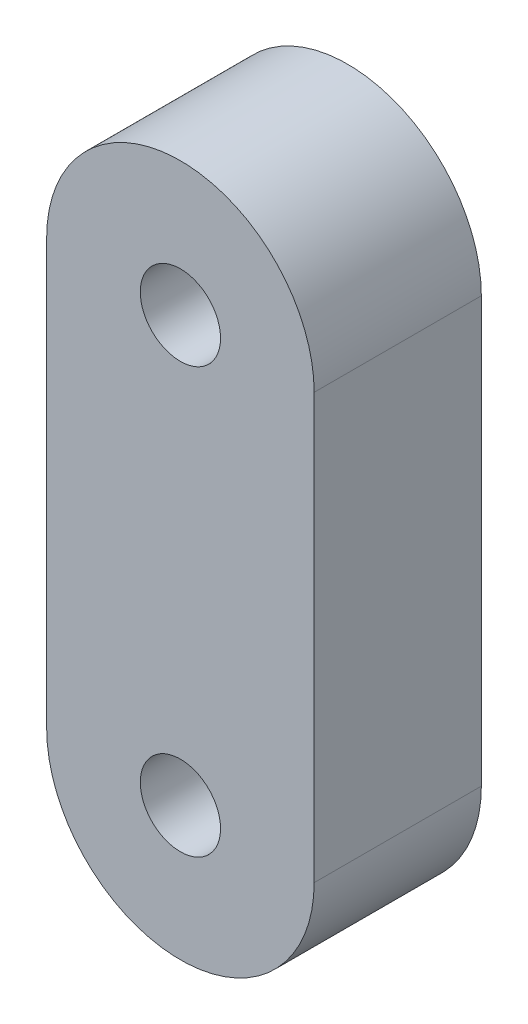
ISO-10303-21;
HEADER;
FILE_DESCRIPTION(('STEP AP214'),'2;1');
FILE_NAME('part.step','',(''),(''),'','','');
FILE_SCHEMA(('AUTOMOTIVE_DESIGN { 1 0 10303 214 1 1 1 1 }'));
ENDSEC;
DATA;
#1=APPLICATION_CONTEXT('core data for automotive mechanical design processes');
#2=APPLICATION_PROTOCOL_DEFINITION('international standard','automotive_design',2000,#1);
#3=PRODUCT_CONTEXT('',#1,'mechanical');
#4=PRODUCT('Part','Part','',(#3));
#5=PRODUCT_RELATED_PRODUCT_CATEGORY('part','',(#4));
#6=PRODUCT_DEFINITION_FORMATION('','',#4);
#7=PRODUCT_DEFINITION_CONTEXT('part definition',#1,'design');
#8=PRODUCT_DEFINITION('design','',#6,#7);
#9=PRODUCT_DEFINITION_SHAPE('','',#8);
#10=(LENGTH_UNIT() NAMED_UNIT(*) SI_UNIT(.MILLI.,.METRE.));
#11=(NAMED_UNIT(*) PLANE_ANGLE_UNIT() SI_UNIT($,.RADIAN.));
#12=(NAMED_UNIT(*) SI_UNIT($,.STERADIAN.) SOLID_ANGLE_UNIT());
#13=UNCERTAINTY_MEASURE_WITH_UNIT(LENGTH_MEASURE(1.E-05),#10,'distance_accuracy_value','');
#14=(GEOMETRIC_REPRESENTATION_CONTEXT(3) GLOBAL_UNCERTAINTY_ASSIGNED_CONTEXT((#13)) GLOBAL_UNIT_ASSIGNED_CONTEXT((#10,
#11,#12)) REPRESENTATION_CONTEXT('',''));
#15=CARTESIAN_POINT('',(0.,0.,0.));
#16=DIRECTION('',(0.,0.,1.));
#17=DIRECTION('',(1.,0.,0.));
#18=AXIS2_PLACEMENT_3D('',#15,#16,#17);
#19=CARTESIAN_POINT('',(0.,-6.35,5.));
#20=DIRECTION('',(0.,0.,1.));
#21=DIRECTION('',(1.,0.,0.));
#22=AXIS2_PLACEMENT_3D('',#19,#20,#21);
#23=PLANE('',#22);
#24=CARTESIAN_POINT('',(0.,6.35,5.));
#25=DIRECTION('',(0.,0.,1.));
#26=DIRECTION('',(1.,0.,0.));
#27=AXIS2_PLACEMENT_3D('',#24,#25,#26);
#28=CIRCLE('',#27,1.2);
#29=CARTESIAN_POINT('',(1.2,6.35,5.));
#30=VERTEX_POINT('',#29);
#31=EDGE_CURVE('E102',#30,#30,#28,.T.);
#32=ORIENTED_EDGE('',*,*,#31,.F.);
#33=EDGE_LOOP('',(#32));
#34=FACE_BOUND('',#33,.T.);
#35=CARTESIAN_POINT('',(0.,-6.35,5.));
#36=DIRECTION('',(0.,0.,1.));
#37=DIRECTION('',(1.,0.,0.));
#38=AXIS2_PLACEMENT_3D('',#35,#36,#37);
#39=CIRCLE('',#38,4.);
#40=CARTESIAN_POINT('',(-4.,-6.35,5.));
#41=VERTEX_POINT('',#40);
#42=CARTESIAN_POINT('',(4.,-6.35,5.));
#43=VERTEX_POINT('',#42);
#44=EDGE_CURVE('E87',#41,#43,#39,.T.);
#45=ORIENTED_EDGE('',*,*,#44,.T.);
#46=DIRECTION('',(0.,1.,0.));
#47=VECTOR('',#46,1.);
#48=CARTESIAN_POINT('',(4.,-6.35,5.));
#49=LINE('',#48,#47);
#50=CARTESIAN_POINT('',(4.,6.35,5.));
#51=VERTEX_POINT('',#50);
#52=EDGE_CURVE('E82',#43,#51,#49,.T.);
#53=ORIENTED_EDGE('',*,*,#52,.T.);
#54=CARTESIAN_POINT('',(0.,6.35,5.));
#55=DIRECTION('',(0.,0.,1.));
#56=DIRECTION('',(1.,0.,0.));
#57=AXIS2_PLACEMENT_3D('',#54,#55,#56);
#58=CIRCLE('',#57,4.);
#59=CARTESIAN_POINT('',(-4.,6.35,5.));
#60=VERTEX_POINT('',#59);
#61=EDGE_CURVE('E85',#51,#60,#58,.T.);
#62=ORIENTED_EDGE('',*,*,#61,.T.);
#63=DIRECTION('',(0.,-1.,0.));
#64=VECTOR('',#63,1.);
#65=CARTESIAN_POINT('',(-4.,-6.35,5.));
#66=LINE('',#65,#64);
#67=EDGE_CURVE('E52',#60,#41,#66,.T.);
#68=ORIENTED_EDGE('',*,*,#67,.T.);
#69=EDGE_LOOP('',(#45,#53,#62,#68));
#70=FACE_BOUND('',#69,.T.);
#71=CARTESIAN_POINT('',(0.,-6.35,5.));
#72=DIRECTION('',(0.,0.,1.));
#73=DIRECTION('',(1.,0.,0.));
#74=AXIS2_PLACEMENT_3D('',#71,#72,#73);
#75=CIRCLE('',#74,1.2);
#76=CARTESIAN_POINT('',(1.2,-6.35,5.));
#77=VERTEX_POINT('',#76);
#78=EDGE_CURVE('E117',#77,#77,#75,.T.);
#79=ORIENTED_EDGE('',*,*,#78,.F.);
#80=EDGE_LOOP('',(#79));
#81=FACE_BOUND('',#80,.T.);
#82=ADVANCED_FACE('F35',(#34,#70,#81),#23,.T.);
#83=CARTESIAN_POINT('',(0.,-6.35,0.));
#84=DIRECTION('',(0.,0.,1.));
#85=DIRECTION('',(1.,0.,0.));
#86=AXIS2_PLACEMENT_3D('',#83,#84,#85);
#87=PLANE('',#86);
#88=CARTESIAN_POINT('',(0.,-6.35,0.));
#89=DIRECTION('',(0.,0.,1.));
#90=DIRECTION('',(1.,0.,0.));
#91=AXIS2_PLACEMENT_3D('',#88,#89,#90);
#92=CIRCLE('',#91,4.);
#93=CARTESIAN_POINT('',(-4.,-6.35,0.));
#94=VERTEX_POINT('',#93);
#95=CARTESIAN_POINT('',(4.,-6.35,0.));
#96=VERTEX_POINT('',#95);
#97=EDGE_CURVE('E99',#94,#96,#92,.T.);
#98=ORIENTED_EDGE('',*,*,#97,.F.);
#99=DIRECTION('',(0.,-1.,0.));
#100=VECTOR('',#99,1.);
#101=CARTESIAN_POINT('',(-4.,-6.35,0.));
#102=LINE('',#101,#100);
#103=CARTESIAN_POINT('',(-4.,6.35,0.));
#104=VERTEX_POINT('',#103);
#105=EDGE_CURVE('E75',#104,#94,#102,.T.);
#106=ORIENTED_EDGE('',*,*,#105,.F.);
#107=CARTESIAN_POINT('',(0.,6.35,0.));
#108=DIRECTION('',(0.,0.,1.));
#109=DIRECTION('',(1.,0.,0.));
#110=AXIS2_PLACEMENT_3D('',#107,#108,#109);
#111=CIRCLE('',#110,4.);
#112=CARTESIAN_POINT('',(4.,6.35,0.));
#113=VERTEX_POINT('',#112);
#114=EDGE_CURVE('E69',#113,#104,#111,.T.);
#115=ORIENTED_EDGE('',*,*,#114,.F.);
#116=DIRECTION('',(0.,1.,0.));
#117=VECTOR('',#116,1.);
#118=CARTESIAN_POINT('',(4.,-6.35,0.));
#119=LINE('',#118,#117);
#120=EDGE_CURVE('E91',#96,#113,#119,.T.);
#121=ORIENTED_EDGE('',*,*,#120,.F.);
#122=EDGE_LOOP('',(#98,#106,#115,#121));
#123=FACE_BOUND('',#122,.T.);
#124=CARTESIAN_POINT('',(0.,6.35,0.));
#125=DIRECTION('',(0.,0.,1.));
#126=DIRECTION('',(1.,0.,0.));
#127=AXIS2_PLACEMENT_3D('',#124,#125,#126);
#128=CIRCLE('',#127,1.2);
#129=CARTESIAN_POINT('',(1.2,6.35,0.));
#130=VERTEX_POINT('',#129);
#131=EDGE_CURVE('E114',#130,#130,#128,.T.);
#132=ORIENTED_EDGE('',*,*,#131,.T.);
#133=EDGE_LOOP('',(#132));
#134=FACE_BOUND('',#133,.T.);
#135=CARTESIAN_POINT('',(0.,-6.35,0.));
#136=DIRECTION('',(0.,0.,1.));
#137=DIRECTION('',(1.,0.,0.));
#138=AXIS2_PLACEMENT_3D('',#135,#136,#137);
#139=CIRCLE('',#138,1.2);
#140=CARTESIAN_POINT('',(1.2,-6.35,0.));
#141=VERTEX_POINT('',#140);
#142=EDGE_CURVE('E120',#141,#141,#139,.T.);
#143=ORIENTED_EDGE('',*,*,#142,.T.);
#144=EDGE_LOOP('',(#143));
#145=FACE_BOUND('',#144,.T.);
#146=ADVANCED_FACE('F110',(#123,#134,#145),#87,.F.);
#147=CARTESIAN_POINT('',(0.,-6.35,5.));
#148=DIRECTION('',(0.,0.,-1.));
#149=DIRECTION('',(-1.,0.,0.));
#150=AXIS2_PLACEMENT_3D('',#147,#148,#149);
#151=CYLINDRICAL_SURFACE('',#150,4.);
#152=ORIENTED_EDGE('',*,*,#97,.T.);
#153=DIRECTION('',(0.,0.,-1.));
#154=VECTOR('',#153,1.);
#155=CARTESIAN_POINT('',(4.,-6.35,5.));
#156=LINE('',#155,#154);
#157=EDGE_CURVE('E11',#43,#96,#156,.T.);
#158=ORIENTED_EDGE('',*,*,#157,.F.);
#159=ORIENTED_EDGE('',*,*,#44,.F.);
#160=DIRECTION('',(0.,0.,-1.));
#161=VECTOR('',#160,1.);
#162=CARTESIAN_POINT('',(-4.,-6.35,5.));
#163=LINE('',#162,#161);
#164=EDGE_CURVE('E95',#41,#94,#163,.T.);
#165=ORIENTED_EDGE('',*,*,#164,.T.);
#166=EDGE_LOOP('',(#152,#158,#159,#165));
#167=FACE_BOUND('',#166,.T.);
#168=ADVANCED_FACE('F37',(#167),#151,.T.);
#169=CARTESIAN_POINT('',(4.,-6.35,5.));
#170=DIRECTION('',(-1.,0.,0.));
#171=DIRECTION('',(0.,-1.,0.));
#172=AXIS2_PLACEMENT_3D('',#169,#170,#171);
#173=PLANE('',#172);
#174=ORIENTED_EDGE('',*,*,#120,.T.);
#175=DIRECTION('',(0.,0.,-1.));
#176=VECTOR('',#175,1.);
#177=CARTESIAN_POINT('',(4.,6.35,5.));
#178=LINE('',#177,#176);
#179=EDGE_CURVE('E44',#51,#113,#178,.T.);
#180=ORIENTED_EDGE('',*,*,#179,.F.);
#181=ORIENTED_EDGE('',*,*,#52,.F.);
#182=ORIENTED_EDGE('',*,*,#157,.T.);
#183=EDGE_LOOP('',(#174,#180,#181,#182));
#184=FACE_BOUND('',#183,.T.);
#185=ADVANCED_FACE('F90',(#184),#173,.F.);
#186=CARTESIAN_POINT('',(0.,6.35,5.));
#187=DIRECTION('',(0.,0.,-1.));
#188=DIRECTION('',(-1.,0.,0.));
#189=AXIS2_PLACEMENT_3D('',#186,#187,#188);
#190=CYLINDRICAL_SURFACE('',#189,4.);
#191=ORIENTED_EDGE('',*,*,#114,.T.);
#192=DIRECTION('',(0.,0.,-1.));
#193=VECTOR('',#192,1.);
#194=CARTESIAN_POINT('',(-4.,6.35,5.));
#195=LINE('',#194,#193);
#196=EDGE_CURVE('E92',#60,#104,#195,.T.);
#197=ORIENTED_EDGE('',*,*,#196,.F.);
#198=ORIENTED_EDGE('',*,*,#61,.F.);
#199=ORIENTED_EDGE('',*,*,#179,.T.);
#200=EDGE_LOOP('',(#191,#197,#198,#199));
#201=FACE_BOUND('',#200,.T.);
#202=ADVANCED_FACE('F93',(#201),#190,.T.);
#203=CARTESIAN_POINT('',(-4.,-6.35,5.));
#204=DIRECTION('',(1.,0.,0.));
#205=DIRECTION('',(0.,1.,0.));
#206=AXIS2_PLACEMENT_3D('',#203,#204,#205);
#207=PLANE('',#206);
#208=ORIENTED_EDGE('',*,*,#105,.T.);
#209=ORIENTED_EDGE('',*,*,#164,.F.);
#210=ORIENTED_EDGE('',*,*,#67,.F.);
#211=ORIENTED_EDGE('',*,*,#196,.T.);
#212=EDGE_LOOP('',(#208,#209,#210,#211));
#213=FACE_BOUND('',#212,.T.);
#214=ADVANCED_FACE('F107',(#213),#207,.F.);
#215=CARTESIAN_POINT('',(0.,6.35,5.));
#216=DIRECTION('',(0.,0.,-1.));
#217=DIRECTION('',(-1.,0.,0.));
#218=AXIS2_PLACEMENT_3D('',#215,#216,#217);
#219=CYLINDRICAL_SURFACE('',#218,1.2);
#220=ORIENTED_EDGE('',*,*,#31,.T.);
#221=EDGE_LOOP('',(#220));
#222=FACE_BOUND('',#221,.T.);
#223=ORIENTED_EDGE('',*,*,#131,.F.);
#224=EDGE_LOOP('',(#223));
#225=FACE_BOUND('',#224,.T.);
#226=ADVANCED_FACE('F137',(#222,#225),#219,.F.);
#227=CARTESIAN_POINT('',(0.,-6.35,5.));
#228=DIRECTION('',(0.,0.,-1.));
#229=DIRECTION('',(-1.,0.,0.));
#230=AXIS2_PLACEMENT_3D('',#227,#228,#229);
#231=CYLINDRICAL_SURFACE('',#230,1.2);
#232=ORIENTED_EDGE('',*,*,#78,.T.);
#233=EDGE_LOOP('',(#232));
#234=FACE_BOUND('',#233,.T.);
#235=ORIENTED_EDGE('',*,*,#142,.F.);
#236=EDGE_LOOP('',(#235));
#237=FACE_BOUND('',#236,.T.);
#238=ADVANCED_FACE('F126',(#234,#237),#231,.F.);
#239=CLOSED_SHELL('',(#82,#146,#168,#185,#202,#214,#226,#238));
#240=MANIFOLD_SOLID_BREP('B2',#239);
#241=ADVANCED_BREP_SHAPE_REPRESENTATION('',(#18,#240),#14);
#242=SHAPE_DEFINITION_REPRESENTATION(#9,#241);
ENDSEC;
END-ISO-10303-21;
